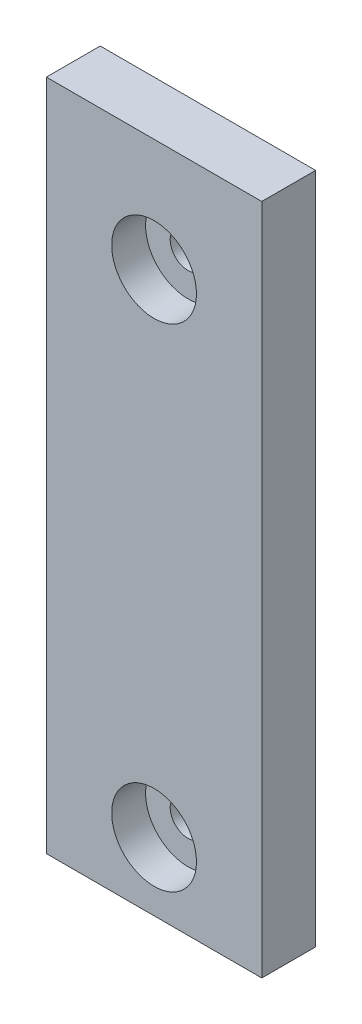
ISO-10303-21;
HEADER;
FILE_DESCRIPTION(('STEP AP214'),'2;1');
FILE_NAME('part.step','',(''),(''),'','','');
FILE_SCHEMA(('AUTOMOTIVE_DESIGN { 1 0 10303 214 1 1 1 1 }'));
ENDSEC;
DATA;
#1=APPLICATION_CONTEXT('core data for automotive mechanical design processes');
#2=APPLICATION_PROTOCOL_DEFINITION('international standard','automotive_design',2000,#1);
#3=PRODUCT_CONTEXT('',#1,'mechanical');
#4=PRODUCT('Part','Part','',(#3));
#5=PRODUCT_RELATED_PRODUCT_CATEGORY('part','',(#4));
#6=PRODUCT_DEFINITION_FORMATION('','',#4);
#7=PRODUCT_DEFINITION_CONTEXT('part definition',#1,'design');
#8=PRODUCT_DEFINITION('design','',#6,#7);
#9=PRODUCT_DEFINITION_SHAPE('','',#8);
#10=(LENGTH_UNIT() NAMED_UNIT(*) SI_UNIT(.MILLI.,.METRE.));
#11=(NAMED_UNIT(*) PLANE_ANGLE_UNIT() SI_UNIT($,.RADIAN.));
#12=(NAMED_UNIT(*) SI_UNIT($,.STERADIAN.) SOLID_ANGLE_UNIT());
#13=UNCERTAINTY_MEASURE_WITH_UNIT(LENGTH_MEASURE(1.E-05),#10,'distance_accuracy_value','');
#14=(GEOMETRIC_REPRESENTATION_CONTEXT(3) GLOBAL_UNCERTAINTY_ASSIGNED_CONTEXT((#13)) GLOBAL_UNIT_ASSIGNED_CONTEXT((#10,
#11,#12)) REPRESENTATION_CONTEXT('',''));
#15=CARTESIAN_POINT('',(0.,0.,0.));
#16=DIRECTION('',(0.,0.,1.));
#17=DIRECTION('',(1.,0.,0.));
#18=AXIS2_PLACEMENT_3D('',#15,#16,#17);
#19=CARTESIAN_POINT('',(19.7561419954302,100.,3.11631140609274));
#20=DIRECTION('',(0.,0.,-1.));
#21=DIRECTION('',(-1.,0.,0.));
#22=AXIS2_PLACEMENT_3D('',#19,#20,#21);
#23=PLANE('',#22);
#24=CARTESIAN_POINT('',(32.4561419954302,81.7,3.11631140609274));
#25=DIRECTION('',(0.,0.,1.));
#26=DIRECTION('',(1.,0.,0.));
#27=AXIS2_PLACEMENT_3D('',#24,#25,#26);
#28=CIRCLE('',#27,5.);
#29=CARTESIAN_POINT('',(37.4561419954302,81.7,3.11631140609274));
#30=VERTEX_POINT('',#29);
#31=EDGE_CURVE('E113',#30,#30,#28,.T.);
#32=ORIENTED_EDGE('',*,*,#31,.F.);
#33=EDGE_LOOP('',(#32));
#34=FACE_BOUND('',#33,.T.);
#35=CARTESIAN_POINT('',(32.4561419954302,23.71,3.11631140609274));
#36=DIRECTION('',(0.,0.,1.));
#37=DIRECTION('',(1.,0.,0.));
#38=AXIS2_PLACEMENT_3D('',#35,#36,#37);
#39=CIRCLE('',#38,5.);
#40=CARTESIAN_POINT('',(37.4561419954302,23.71,3.11631140609274));
#41=VERTEX_POINT('',#40);
#42=EDGE_CURVE('E121',#41,#41,#39,.T.);
#43=ORIENTED_EDGE('',*,*,#42,.F.);
#44=EDGE_LOOP('',(#43));
#45=FACE_BOUND('',#44,.T.);
#46=DIRECTION('',(-1.,0.,0.));
#47=VECTOR('',#46,1.);
#48=CARTESIAN_POINT('',(19.7561419954302,15.7,3.11631140609274));
#49=LINE('',#48,#47);
#50=CARTESIAN_POINT('',(45.1561419954302,15.7,3.11631140609274));
#51=VERTEX_POINT('',#50);
#52=CARTESIAN_POINT('',(19.7561419954302,15.7,3.11631140609274));
#53=VERTEX_POINT('',#52);
#54=EDGE_CURVE('E89',#51,#53,#49,.T.);
#55=ORIENTED_EDGE('',*,*,#54,.F.);
#56=DIRECTION('',(0.,-1.,0.));
#57=VECTOR('',#56,1.);
#58=CARTESIAN_POINT('',(45.1561419954302,100.,3.11631140609274));
#59=LINE('',#58,#57);
#60=CARTESIAN_POINT('',(45.1561419954302,95.,3.11631140609274));
#61=VERTEX_POINT('',#60);
#62=EDGE_CURVE('E49',#61,#51,#59,.T.);
#63=ORIENTED_EDGE('',*,*,#62,.F.);
#64=DIRECTION('',(1.,0.,0.));
#65=VECTOR('',#64,1.);
#66=CARTESIAN_POINT('',(19.7561419954302,95.,3.11631140609274));
#67=LINE('',#66,#65);
#68=CARTESIAN_POINT('',(19.7561419954302,95.,3.11631140609274));
#69=VERTEX_POINT('',#68);
#70=EDGE_CURVE('E161',#69,#61,#67,.T.);
#71=ORIENTED_EDGE('',*,*,#70,.F.);
#72=DIRECTION('',(0.,-1.,0.));
#73=VECTOR('',#72,1.);
#74=CARTESIAN_POINT('',(19.7561419954302,100.,3.11631140609274));
#75=LINE('',#74,#73);
#76=EDGE_CURVE('E11',#69,#53,#75,.T.);
#77=ORIENTED_EDGE('',*,*,#76,.T.);
#78=EDGE_LOOP('',(#55,#63,#71,#77));
#79=FACE_BOUND('',#78,.T.);
#80=ADVANCED_FACE('F41',(#34,#45,#79),#23,.F.);
#81=CARTESIAN_POINT('',(45.1561419954302,100.,3.11631140609274));
#82=DIRECTION('',(-1.,0.,0.));
#83=DIRECTION('',(0.,0.,1.));
#84=AXIS2_PLACEMENT_3D('',#81,#82,#83);
#85=PLANE('',#84);
#86=DIRECTION('',(0.,0.,1.));
#87=VECTOR('',#86,1.);
#88=CARTESIAN_POINT('',(45.1561419954302,15.7,-3.23368859390726));
#89=LINE('',#88,#87);
#90=CARTESIAN_POINT('',(45.1561419954302,15.7,-3.23368859390726));
#91=VERTEX_POINT('',#90);
#92=EDGE_CURVE('E83',#91,#51,#89,.T.);
#93=ORIENTED_EDGE('',*,*,#92,.F.);
#94=DIRECTION('',(0.,-1.,0.));
#95=VECTOR('',#94,1.);
#96=CARTESIAN_POINT('',(45.1561419954302,100.,-3.23368859390726));
#97=LINE('',#96,#95);
#98=CARTESIAN_POINT('',(45.1561419954302,95.,-3.23368859390726));
#99=VERTEX_POINT('',#98);
#100=EDGE_CURVE('E96',#99,#91,#97,.T.);
#101=ORIENTED_EDGE('',*,*,#100,.F.);
#102=DIRECTION('',(0.,0.,1.));
#103=VECTOR('',#102,1.);
#104=CARTESIAN_POINT('',(45.1561419954302,95.,-3.23368859390726));
#105=LINE('',#104,#103);
#106=EDGE_CURVE('E69',#99,#61,#105,.T.);
#107=ORIENTED_EDGE('',*,*,#106,.T.);
#108=ORIENTED_EDGE('',*,*,#62,.T.);
#109=EDGE_LOOP('',(#93,#101,#107,#108));
#110=FACE_BOUND('',#109,.T.);
#111=ADVANCED_FACE('F92',(#110),#85,.F.);
#112=CARTESIAN_POINT('',(19.7561419954302,100.,3.11631140609274));
#113=DIRECTION('',(1.,0.,0.));
#114=DIRECTION('',(0.,0.,-1.));
#115=AXIS2_PLACEMENT_3D('',#112,#113,#114);
#116=PLANE('',#115);
#117=DIRECTION('',(0.,-1.,0.));
#118=VECTOR('',#117,1.);
#119=CARTESIAN_POINT('',(19.7561419954302,100.,-3.23368859390726));
#120=LINE('',#119,#118);
#121=CARTESIAN_POINT('',(19.7561419954302,95.,-3.23368859390726));
#122=VERTEX_POINT('',#121);
#123=CARTESIAN_POINT('',(19.7561419954302,15.7,-3.23368859390726));
#124=VERTEX_POINT('',#123);
#125=EDGE_CURVE('E101',#122,#124,#120,.T.);
#126=ORIENTED_EDGE('',*,*,#125,.T.);
#127=DIRECTION('',(0.,0.,1.));
#128=VECTOR('',#127,1.);
#129=CARTESIAN_POINT('',(19.7561419954302,15.7,-3.23368859390726));
#130=LINE('',#129,#128);
#131=EDGE_CURVE('E59',#124,#53,#130,.T.);
#132=ORIENTED_EDGE('',*,*,#131,.T.);
#133=ORIENTED_EDGE('',*,*,#76,.F.);
#134=DIRECTION('',(0.,0.,1.));
#135=VECTOR('',#134,1.);
#136=CARTESIAN_POINT('',(19.7561419954302,95.,-3.23368859390726));
#137=LINE('',#136,#135);
#138=EDGE_CURVE('E163',#122,#69,#137,.T.);
#139=ORIENTED_EDGE('',*,*,#138,.F.);
#140=EDGE_LOOP('',(#126,#132,#133,#139));
#141=FACE_BOUND('',#140,.T.);
#142=ADVANCED_FACE('F43',(#141),#116,.F.);
#143=CARTESIAN_POINT('',(32.4561419954302,23.71,-3.23368859390726));
#144=DIRECTION('',(0.,0.,1.));
#145=DIRECTION('',(1.,0.,0.));
#146=AXIS2_PLACEMENT_3D('',#143,#144,#145);
#147=CYLINDRICAL_SURFACE('',#146,2.1);
#148=CARTESIAN_POINT('',(32.4561419954302,23.71,-3.23368859390726));
#149=DIRECTION('',(0.,0.,1.));
#150=DIRECTION('',(1.,0.,0.));
#151=AXIS2_PLACEMENT_3D('',#148,#149,#150);
#152=CIRCLE('',#151,2.1);
#153=CARTESIAN_POINT('',(34.5561419954302,23.71,-3.23368859390726));
#154=VERTEX_POINT('',#153);
#155=EDGE_CURVE('E108',#154,#154,#152,.T.);
#156=ORIENTED_EDGE('',*,*,#155,.F.);
#157=EDGE_LOOP('',(#156));
#158=FACE_BOUND('',#157,.T.);
#159=CARTESIAN_POINT('',(32.4561419954302,23.71,-0.883688593907256));
#160=DIRECTION('',(0.,0.,1.));
#161=DIRECTION('',(1.,0.,0.));
#162=AXIS2_PLACEMENT_3D('',#159,#160,#161);
#163=CIRCLE('',#162,2.1);
#164=CARTESIAN_POINT('',(34.5561419954302,23.71,-0.883688593907256));
#165=VERTEX_POINT('',#164);
#166=EDGE_CURVE('E44',#165,#165,#163,.F.);
#167=ORIENTED_EDGE('',*,*,#166,.F.);
#168=EDGE_LOOP('',(#167));
#169=FACE_BOUND('',#168,.T.);
#170=ADVANCED_FACE('F134',(#158,#169),#147,.F.);
#171=CARTESIAN_POINT('',(32.4561419954302,81.7,-3.23368859390726));
#172=DIRECTION('',(0.,0.,1.));
#173=DIRECTION('',(1.,0.,0.));
#174=AXIS2_PLACEMENT_3D('',#171,#172,#173);
#175=CYLINDRICAL_SURFACE('',#174,2.1);
#176=CARTESIAN_POINT('',(32.4561419954302,81.7,-3.23368859390726));
#177=DIRECTION('',(0.,0.,1.));
#178=DIRECTION('',(1.,0.,0.));
#179=AXIS2_PLACEMENT_3D('',#176,#177,#178);
#180=CIRCLE('',#179,2.1);
#181=CARTESIAN_POINT('',(34.5561419954302,81.7,-3.23368859390726));
#182=VERTEX_POINT('',#181);
#183=EDGE_CURVE('E102',#182,#182,#180,.T.);
#184=ORIENTED_EDGE('',*,*,#183,.F.);
#185=EDGE_LOOP('',(#184));
#186=FACE_BOUND('',#185,.T.);
#187=CARTESIAN_POINT('',(32.4561419954302,81.7,-0.883688593907256));
#188=DIRECTION('',(0.,0.,1.));
#189=DIRECTION('',(1.,0.,0.));
#190=AXIS2_PLACEMENT_3D('',#187,#188,#189);
#191=CIRCLE('',#190,2.1);
#192=CARTESIAN_POINT('',(34.5561419954302,81.7,-0.883688593907256));
#193=VERTEX_POINT('',#192);
#194=EDGE_CURVE('E110',#193,#193,#191,.F.);
#195=ORIENTED_EDGE('',*,*,#194,.F.);
#196=EDGE_LOOP('',(#195));
#197=FACE_BOUND('',#196,.T.);
#198=ADVANCED_FACE('F128',(#186,#197),#175,.F.);
#199=CARTESIAN_POINT('',(19.7561419954302,100.,-3.23368859390726));
#200=DIRECTION('',(0.,0.,1.));
#201=DIRECTION('',(1.,0.,0.));
#202=AXIS2_PLACEMENT_3D('',#199,#200,#201);
#203=PLANE('',#202);
#204=ORIENTED_EDGE('',*,*,#183,.T.);
#205=EDGE_LOOP('',(#204));
#206=FACE_BOUND('',#205,.T.);
#207=ORIENTED_EDGE('',*,*,#155,.T.);
#208=EDGE_LOOP('',(#207));
#209=FACE_BOUND('',#208,.T.);
#210=ORIENTED_EDGE('',*,*,#100,.T.);
#211=DIRECTION('',(-1.,0.,0.));
#212=VECTOR('',#211,1.);
#213=CARTESIAN_POINT('',(19.7561419954302,15.7,-3.23368859390726));
#214=LINE('',#213,#212);
#215=EDGE_CURVE('E84',#91,#124,#214,.T.);
#216=ORIENTED_EDGE('',*,*,#215,.T.);
#217=ORIENTED_EDGE('',*,*,#125,.F.);
#218=DIRECTION('',(1.,0.,0.));
#219=VECTOR('',#218,1.);
#220=CARTESIAN_POINT('',(19.7561419954302,95.,-3.23368859390726));
#221=LINE('',#220,#219);
#222=EDGE_CURVE('E99',#122,#99,#221,.T.);
#223=ORIENTED_EDGE('',*,*,#222,.T.);
#224=EDGE_LOOP('',(#210,#216,#217,#223));
#225=FACE_BOUND('',#224,.T.);
#226=ADVANCED_FACE('F97',(#206,#209,#225),#203,.F.);
#227=CARTESIAN_POINT('',(32.4561419954302,81.7,-0.883688593907256));
#228=DIRECTION('',(0.,0.,1.));
#229=DIRECTION('',(1.,0.,0.));
#230=AXIS2_PLACEMENT_3D('',#227,#228,#229);
#231=PLANE('',#230);
#232=CARTESIAN_POINT('',(32.4561419954302,81.7,-0.883688593907256));
#233=DIRECTION('',(0.,0.,1.));
#234=DIRECTION('',(1.,0.,0.));
#235=AXIS2_PLACEMENT_3D('',#232,#233,#234);
#236=CIRCLE('',#235,5.);
#237=CARTESIAN_POINT('',(37.4561419954302,81.7,-0.883688593907256));
#238=VERTEX_POINT('',#237);
#239=EDGE_CURVE('E109',#238,#238,#236,.T.);
#240=ORIENTED_EDGE('',*,*,#239,.T.);
#241=EDGE_LOOP('',(#240));
#242=FACE_BOUND('',#241,.T.);
#243=ORIENTED_EDGE('',*,*,#194,.T.);
#244=EDGE_LOOP('',(#243));
#245=FACE_BOUND('',#244,.T.);
#246=ADVANCED_FACE('F138',(#242,#245),#231,.T.);
#247=CARTESIAN_POINT('',(32.4561419954302,81.7,-0.883688593907256));
#248=DIRECTION('',(0.,0.,1.));
#249=DIRECTION('',(1.,0.,0.));
#250=AXIS2_PLACEMENT_3D('',#247,#248,#249);
#251=CYLINDRICAL_SURFACE('',#250,5.);
#252=ORIENTED_EDGE('',*,*,#239,.F.);
#253=EDGE_LOOP('',(#252));
#254=FACE_BOUND('',#253,.T.);
#255=ORIENTED_EDGE('',*,*,#31,.T.);
#256=EDGE_LOOP('',(#255));
#257=FACE_BOUND('',#256,.T.);
#258=ADVANCED_FACE('F181',(#254,#257),#251,.F.);
#259=CARTESIAN_POINT('',(32.4561419954302,23.71,-0.883688593907256));
#260=DIRECTION('',(0.,0.,1.));
#261=DIRECTION('',(1.,0.,0.));
#262=AXIS2_PLACEMENT_3D('',#259,#260,#261);
#263=PLANE('',#262);
#264=CARTESIAN_POINT('',(32.4561419954302,23.71,-0.883688593907256));
#265=DIRECTION('',(0.,0.,1.));
#266=DIRECTION('',(1.,0.,0.));
#267=AXIS2_PLACEMENT_3D('',#264,#265,#266);
#268=CIRCLE('',#267,5.);
#269=CARTESIAN_POINT('',(37.4561419954302,23.71,-0.883688593907256));
#270=VERTEX_POINT('',#269);
#271=EDGE_CURVE('E170',#270,#270,#268,.T.);
#272=ORIENTED_EDGE('',*,*,#271,.T.);
#273=EDGE_LOOP('',(#272));
#274=FACE_BOUND('',#273,.T.);
#275=ORIENTED_EDGE('',*,*,#166,.T.);
#276=EDGE_LOOP('',(#275));
#277=FACE_BOUND('',#276,.T.);
#278=ADVANCED_FACE('F179',(#274,#277),#263,.T.);
#279=CARTESIAN_POINT('',(32.4561419954302,23.71,-0.883688593907256));
#280=DIRECTION('',(0.,0.,1.));
#281=DIRECTION('',(1.,0.,0.));
#282=AXIS2_PLACEMENT_3D('',#279,#280,#281);
#283=CYLINDRICAL_SURFACE('',#282,5.);
#284=ORIENTED_EDGE('',*,*,#271,.F.);
#285=EDGE_LOOP('',(#284));
#286=FACE_BOUND('',#285,.T.);
#287=ORIENTED_EDGE('',*,*,#42,.T.);
#288=EDGE_LOOP('',(#287));
#289=FACE_BOUND('',#288,.T.);
#290=ADVANCED_FACE('F174',(#286,#289),#283,.F.);
#291=CARTESIAN_POINT('',(19.7561419954302,95.,-3.23368859390726));
#292=DIRECTION('',(0.,-1.,0.));
#293=DIRECTION('',(0.,0.,-1.));
#294=AXIS2_PLACEMENT_3D('',#291,#292,#293);
#295=PLANE('',#294);
#296=ORIENTED_EDGE('',*,*,#70,.T.);
#297=ORIENTED_EDGE('',*,*,#106,.F.);
#298=ORIENTED_EDGE('',*,*,#222,.F.);
#299=ORIENTED_EDGE('',*,*,#138,.T.);
#300=EDGE_LOOP('',(#296,#297,#298,#299));
#301=FACE_BOUND('',#300,.T.);
#302=ADVANCED_FACE('F175',(#301),#295,.F.);
#303=CARTESIAN_POINT('',(19.7561419954302,15.7,-3.23368859390726));
#304=DIRECTION('',(0.,1.,0.));
#305=DIRECTION('',(0.,0.,1.));
#306=AXIS2_PLACEMENT_3D('',#303,#304,#305);
#307=PLANE('',#306);
#308=ORIENTED_EDGE('',*,*,#54,.T.);
#309=ORIENTED_EDGE('',*,*,#131,.F.);
#310=ORIENTED_EDGE('',*,*,#215,.F.);
#311=ORIENTED_EDGE('',*,*,#92,.T.);
#312=EDGE_LOOP('',(#308,#309,#310,#311));
#313=FACE_BOUND('',#312,.T.);
#314=ADVANCED_FACE('F85',(#313),#307,.F.);
#315=CLOSED_SHELL('',(#80,#111,#142,#170,#198,#226,#246,#258,#278,#290,#302,#314));
#316=MANIFOLD_SOLID_BREP('B2',#315);
#317=ADVANCED_BREP_SHAPE_REPRESENTATION('',(#18,#316),#14);
#318=SHAPE_DEFINITION_REPRESENTATION(#9,#317);
ENDSEC;
END-ISO-10303-21;
